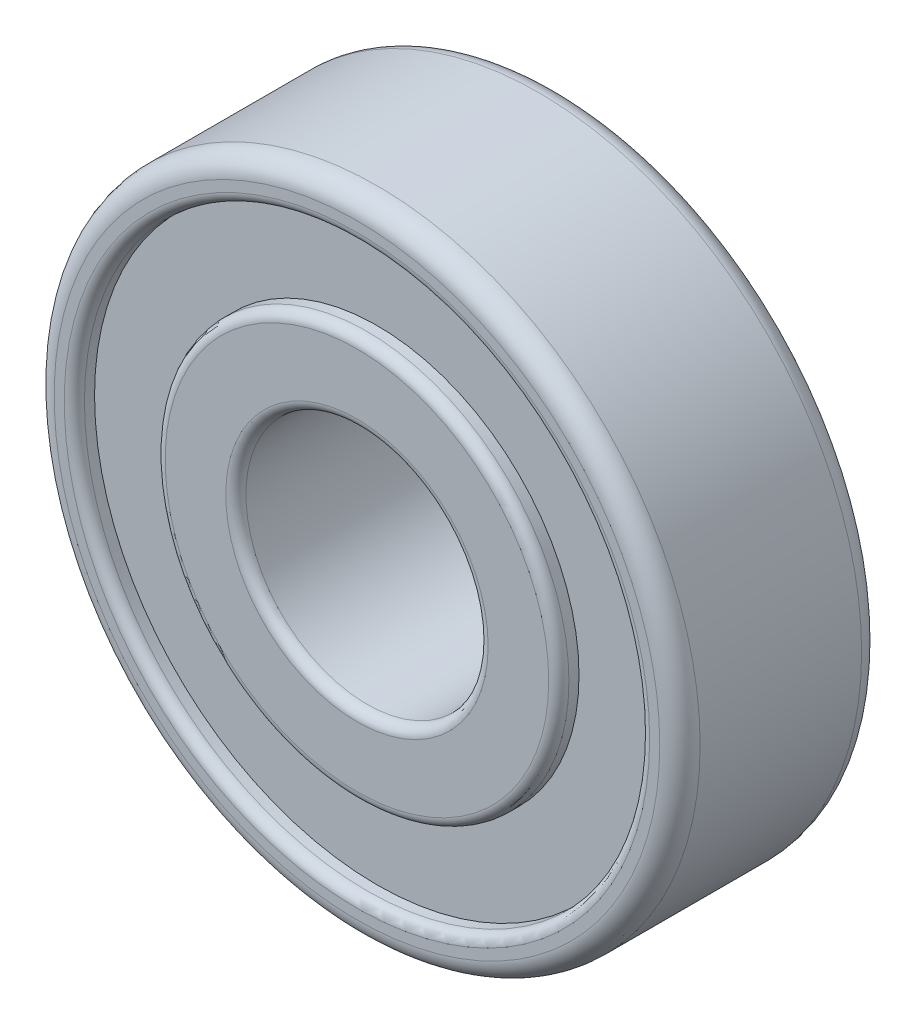
ISO-10303-21;
HEADER;
FILE_DESCRIPTION(('STEP AP214'),'2;1');
FILE_NAME('part.step','',(''),(''),'','','');
FILE_SCHEMA(('AUTOMOTIVE_DESIGN { 1 0 10303 214 1 1 1 1 }'));
ENDSEC;
DATA;
#1=APPLICATION_CONTEXT('core data for automotive mechanical design processes');
#2=APPLICATION_PROTOCOL_DEFINITION('international standard','automotive_design',2000,#1);
#3=PRODUCT_CONTEXT('',#1,'mechanical');
#4=PRODUCT('Part','Part','',(#3));
#5=PRODUCT_RELATED_PRODUCT_CATEGORY('part','',(#4));
#6=PRODUCT_DEFINITION_FORMATION('','',#4);
#7=PRODUCT_DEFINITION_CONTEXT('part definition',#1,'design');
#8=PRODUCT_DEFINITION('design','',#6,#7);
#9=PRODUCT_DEFINITION_SHAPE('','',#8);
#10=(LENGTH_UNIT() NAMED_UNIT(*) SI_UNIT(.MILLI.,.METRE.));
#11=(NAMED_UNIT(*) PLANE_ANGLE_UNIT() SI_UNIT($,.RADIAN.));
#12=(NAMED_UNIT(*) SI_UNIT($,.STERADIAN.) SOLID_ANGLE_UNIT());
#13=UNCERTAINTY_MEASURE_WITH_UNIT(LENGTH_MEASURE(1.E-05),#10,'distance_accuracy_value','');
#14=(GEOMETRIC_REPRESENTATION_CONTEXT(3) GLOBAL_UNCERTAINTY_ASSIGNED_CONTEXT((#13)) GLOBAL_UNIT_ASSIGNED_CONTEXT((#10,
#11,#12)) REPRESENTATION_CONTEXT('',''));
#15=CARTESIAN_POINT('',(0.,0.,0.));
#16=DIRECTION('',(0.,0.,1.));
#17=DIRECTION('',(1.,0.,0.));
#18=AXIS2_PLACEMENT_3D('',#15,#16,#17);
#19=CARTESIAN_POINT('',(0.,0.,0.));
#20=DIRECTION('',(0.,0.,1.));
#21=DIRECTION('',(1.,0.,0.));
#22=AXIS2_PLACEMENT_3D('',#19,#20,#21);
#23=PLANE('',#22);
#24=CARTESIAN_POINT('',(0.,0.,0.));
#25=DIRECTION('',(0.,0.,1.));
#26=DIRECTION('',(1.,0.,0.));
#27=AXIS2_PLACEMENT_3D('',#24,#25,#26);
#28=CIRCLE('',#27,6.5);
#29=CARTESIAN_POINT('',(6.5,0.,0.));
#30=VERTEX_POINT('',#29);
#31=EDGE_CURVE('E85',#30,#30,#28,.T.);
#32=ORIENTED_EDGE('',*,*,#31,.T.);
#33=EDGE_LOOP('',(#32));
#34=FACE_BOUND('',#33,.T.);
#35=CARTESIAN_POINT('',(0.,0.,0.));
#36=DIRECTION('',(0.,0.,1.));
#37=DIRECTION('',(1.,0.,0.));
#38=AXIS2_PLACEMENT_3D('',#35,#36,#37);
#39=CIRCLE('',#38,8.5);
#40=CARTESIAN_POINT('',(8.5,0.,0.));
#41=VERTEX_POINT('',#40);
#42=EDGE_CURVE('E89',#41,#41,#39,.F.);
#43=ORIENTED_EDGE('',*,*,#42,.T.);
#44=EDGE_LOOP('',(#43));
#45=FACE_BOUND('',#44,.T.);
#46=ADVANCED_FACE('F37',(#34,#45),#23,.F.);
#47=CARTESIAN_POINT('',(0.,0.,10.));
#48=DIRECTION('',(0.,0.,1.));
#49=DIRECTION('',(1.,0.,0.));
#50=AXIS2_PLACEMENT_3D('',#47,#48,#49);
#51=PLANE('',#50);
#52=CARTESIAN_POINT('',(0.,0.,10.));
#53=DIRECTION('',(0.,0.,1.));
#54=DIRECTION('',(1.,0.,0.));
#55=AXIS2_PLACEMENT_3D('',#52,#53,#54);
#56=CIRCLE('',#55,6.5);
#57=CARTESIAN_POINT('',(6.5,0.,10.));
#58=VERTEX_POINT('',#57);
#59=EDGE_CURVE('E69',#58,#58,#56,.F.);
#60=ORIENTED_EDGE('',*,*,#59,.T.);
#61=EDGE_LOOP('',(#60));
#62=FACE_BOUND('',#61,.T.);
#63=CARTESIAN_POINT('',(0.,0.,10.));
#64=DIRECTION('',(0.,0.,1.));
#65=DIRECTION('',(1.,0.,0.));
#66=AXIS2_PLACEMENT_3D('',#63,#64,#65);
#67=CIRCLE('',#66,9.5);
#68=CARTESIAN_POINT('',(9.5,0.,10.));
#69=VERTEX_POINT('',#68);
#70=EDGE_CURVE('E73',#69,#69,#67,.T.);
#71=ORIENTED_EDGE('',*,*,#70,.T.);
#72=EDGE_LOOP('',(#71));
#73=FACE_BOUND('',#72,.T.);
#74=ADVANCED_FACE('F145',(#62,#73),#51,.T.);
#75=CARTESIAN_POINT('',(0.,0.,10.));
#76=DIRECTION('',(0.,0.,1.));
#77=DIRECTION('',(1.,0.,0.));
#78=AXIS2_PLACEMENT_3D('',#75,#76,#77);
#79=CIRCLE('',#78,14.5);
#80=CARTESIAN_POINT('',(14.5,0.,10.));
#81=VERTEX_POINT('',#80);
#82=EDGE_CURVE('E50',#81,#81,#79,.F.);
#83=ORIENTED_EDGE('',*,*,#82,.T.);
#84=EDGE_LOOP('',(#83));
#85=FACE_BOUND('',#84,.T.);
#86=CARTESIAN_POINT('',(0.,0.,10.));
#87=DIRECTION('',(0.,0.,1.));
#88=DIRECTION('',(1.,0.,0.));
#89=AXIS2_PLACEMENT_3D('',#86,#87,#88);
#90=CIRCLE('',#89,15.);
#91=CARTESIAN_POINT('',(15.,0.,10.));
#92=VERTEX_POINT('',#91);
#93=EDGE_CURVE('E105',#92,#92,#90,.T.);
#94=ORIENTED_EDGE('',*,*,#93,.T.);
#95=EDGE_LOOP('',(#94));
#96=FACE_BOUND('',#95,.T.);
#97=ADVANCED_FACE('F152',(#85,#96),#51,.T.);
#98=CARTESIAN_POINT('',(0.,0.,0.));
#99=DIRECTION('',(0.,0.,1.));
#100=DIRECTION('',(1.,0.,0.));
#101=AXIS2_PLACEMENT_3D('',#98,#99,#100);
#102=CIRCLE('',#101,13.);
#103=CARTESIAN_POINT('',(13.,0.,0.));
#104=VERTEX_POINT('',#103);
#105=EDGE_CURVE('E61',#104,#104,#102,.T.);
#106=ORIENTED_EDGE('',*,*,#105,.T.);
#107=EDGE_LOOP('',(#106));
#108=FACE_BOUND('',#107,.T.);
#109=CARTESIAN_POINT('',(0.,0.,0.));
#110=DIRECTION('',(0.,0.,1.));
#111=DIRECTION('',(1.,0.,0.));
#112=AXIS2_PLACEMENT_3D('',#109,#110,#111);
#113=CIRCLE('',#112,15.);
#114=CARTESIAN_POINT('',(15.,0.,0.));
#115=VERTEX_POINT('',#114);
#116=EDGE_CURVE('E93',#115,#115,#113,.F.);
#117=ORIENTED_EDGE('',*,*,#116,.T.);
#118=EDGE_LOOP('',(#117));
#119=FACE_BOUND('',#118,.T.);
#120=ADVANCED_FACE('F148',(#108,#119),#23,.F.);
#121=CARTESIAN_POINT('',(0.,0.,10.));
#122=DIRECTION('',(0.,0.,-1.));
#123=DIRECTION('',(-1.,0.,0.));
#124=AXIS2_PLACEMENT_3D('',#121,#122,#123);
#125=CYLINDRICAL_SURFACE('',#124,16.);
#126=CARTESIAN_POINT('',(0.,0.,9.));
#127=DIRECTION('',(0.,0.,1.));
#128=DIRECTION('',(1.,0.,0.));
#129=AXIS2_PLACEMENT_3D('',#126,#127,#128);
#130=CIRCLE('',#129,16.);
#131=CARTESIAN_POINT('',(16.,0.,9.));
#132=VERTEX_POINT('',#131);
#133=EDGE_CURVE('E97',#132,#132,#130,.F.);
#134=ORIENTED_EDGE('',*,*,#133,.T.);
#135=EDGE_LOOP('',(#134));
#136=FACE_BOUND('',#135,.T.);
#137=CARTESIAN_POINT('',(0.,0.,0.999999999999999));
#138=DIRECTION('',(0.,0.,1.));
#139=DIRECTION('',(1.,0.,0.));
#140=AXIS2_PLACEMENT_3D('',#137,#138,#139);
#141=CIRCLE('',#140,16.);
#142=CARTESIAN_POINT('',(16.,0.,0.999999999999999));
#143=VERTEX_POINT('',#142);
#144=EDGE_CURVE('E101',#143,#143,#141,.T.);
#145=ORIENTED_EDGE('',*,*,#144,.T.);
#146=EDGE_LOOP('',(#145));
#147=FACE_BOUND('',#146,.T.);
#148=ADVANCED_FACE('F158',(#136,#147),#125,.T.);
#149=CARTESIAN_POINT('',(0.,0.,10.));
#150=DIRECTION('',(0.,0.,-1.));
#151=DIRECTION('',(-1.,0.,0.));
#152=AXIS2_PLACEMENT_3D('',#149,#150,#151);
#153=CYLINDRICAL_SURFACE('',#152,6.);
#154=CARTESIAN_POINT('',(0.,0.,0.5));
#155=DIRECTION('',(0.,0.,1.));
#156=DIRECTION('',(1.,0.,0.));
#157=AXIS2_PLACEMENT_3D('',#154,#155,#156);
#158=CIRCLE('',#157,6.);
#159=CARTESIAN_POINT('',(6.,0.,0.5));
#160=VERTEX_POINT('',#159);
#161=EDGE_CURVE('E77',#160,#160,#158,.F.);
#162=ORIENTED_EDGE('',*,*,#161,.T.);
#163=EDGE_LOOP('',(#162));
#164=FACE_BOUND('',#163,.T.);
#165=CARTESIAN_POINT('',(0.,0.,9.5));
#166=DIRECTION('',(0.,0.,1.));
#167=DIRECTION('',(1.,0.,0.));
#168=AXIS2_PLACEMENT_3D('',#165,#166,#167);
#169=CIRCLE('',#168,6.);
#170=CARTESIAN_POINT('',(6.,0.,9.5));
#171=VERTEX_POINT('',#170);
#172=EDGE_CURVE('E81',#171,#171,#169,.T.);
#173=ORIENTED_EDGE('',*,*,#172,.T.);
#174=EDGE_LOOP('',(#173));
#175=FACE_BOUND('',#174,.T.);
#176=ADVANCED_FACE('F164',(#164,#175),#153,.F.);
#177=CARTESIAN_POINT('',(0.,0.,9.));
#178=DIRECTION('',(0.,0.,1.));
#179=DIRECTION('',(1.,0.,0.));
#180=AXIS2_PLACEMENT_3D('',#177,#178,#179);
#181=CYLINDRICAL_SURFACE('',#180,14.);
#182=CARTESIAN_POINT('',(0.,0.,9.5));
#183=DIRECTION('',(0.,0.,1.));
#184=DIRECTION('',(1.,0.,0.));
#185=AXIS2_PLACEMENT_3D('',#182,#183,#184);
#186=CIRCLE('',#185,14.);
#187=CARTESIAN_POINT('',(14.,0.,9.5));
#188=VERTEX_POINT('',#187);
#189=EDGE_CURVE('E55',#188,#188,#186,.T.);
#190=ORIENTED_EDGE('',*,*,#189,.T.);
#191=EDGE_LOOP('',(#190));
#192=FACE_BOUND('',#191,.T.);
#193=CARTESIAN_POINT('',(0.,0.,9.));
#194=DIRECTION('',(0.,0.,1.));
#195=DIRECTION('',(1.,0.,0.));
#196=AXIS2_PLACEMENT_3D('',#193,#194,#195);
#197=CIRCLE('',#196,14.);
#198=CARTESIAN_POINT('',(14.,0.,9.));
#199=VERTEX_POINT('',#198);
#200=EDGE_CURVE('E109',#199,#199,#197,.T.);
#201=ORIENTED_EDGE('',*,*,#200,.F.);
#202=EDGE_LOOP('',(#201));
#203=FACE_BOUND('',#202,.T.);
#204=ADVANCED_FACE('F270',(#192,#203),#181,.F.);
#205=CARTESIAN_POINT('',(0.,0.,9.));
#206=DIRECTION('',(0.,0.,1.));
#207=DIRECTION('',(1.,0.,0.));
#208=AXIS2_PLACEMENT_3D('',#205,#206,#207);
#209=PLANE('',#208);
#210=CARTESIAN_POINT('',(0.,0.,9.));
#211=DIRECTION('',(0.,0.,1.));
#212=DIRECTION('',(1.,0.,0.));
#213=AXIS2_PLACEMENT_3D('',#210,#211,#212);
#214=CIRCLE('',#213,10.);
#215=CARTESIAN_POINT('',(10.,0.,9.));
#216=VERTEX_POINT('',#215);
#217=EDGE_CURVE('E113',#216,#216,#214,.T.);
#218=ORIENTED_EDGE('',*,*,#217,.F.);
#219=EDGE_LOOP('',(#218));
#220=FACE_BOUND('',#219,.T.);
#221=ORIENTED_EDGE('',*,*,#200,.T.);
#222=EDGE_LOOP('',(#221));
#223=FACE_BOUND('',#222,.T.);
#224=ADVANCED_FACE('F142',(#220,#223),#209,.T.);
#225=CARTESIAN_POINT('',(0.,0.,9.));
#226=DIRECTION('',(0.,0.,1.));
#227=DIRECTION('',(1.,0.,0.));
#228=AXIS2_PLACEMENT_3D('',#225,#226,#227);
#229=CYLINDRICAL_SURFACE('',#228,10.);
#230=CARTESIAN_POINT('',(0.,0.,9.5));
#231=DIRECTION('',(0.,0.,1.));
#232=DIRECTION('',(1.,0.,0.));
#233=AXIS2_PLACEMENT_3D('',#230,#231,#232);
#234=CIRCLE('',#233,10.);
#235=CARTESIAN_POINT('',(10.,0.,9.5));
#236=VERTEX_POINT('',#235);
#237=EDGE_CURVE('E45',#236,#236,#234,.F.);
#238=ORIENTED_EDGE('',*,*,#237,.T.);
#239=EDGE_LOOP('',(#238));
#240=FACE_BOUND('',#239,.T.);
#241=ORIENTED_EDGE('',*,*,#217,.T.);
#242=EDGE_LOOP('',(#241));
#243=FACE_BOUND('',#242,.T.);
#244=ADVANCED_FACE('F136',(#240,#243),#229,.T.);
#245=CARTESIAN_POINT('',(0.,0.,1.));
#246=DIRECTION('',(0.,0.,-1.));
#247=DIRECTION('',(-1.,0.,0.));
#248=AXIS2_PLACEMENT_3D('',#245,#246,#247);
#249=CYLINDRICAL_SURFACE('',#248,12.5);
#250=CARTESIAN_POINT('',(0.,0.,0.5));
#251=DIRECTION('',(0.,0.,1.));
#252=DIRECTION('',(1.,0.,0.));
#253=AXIS2_PLACEMENT_3D('',#250,#251,#252);
#254=CIRCLE('',#253,12.5);
#255=CARTESIAN_POINT('',(12.5,0.,0.5));
#256=VERTEX_POINT('',#255);
#257=EDGE_CURVE('E65',#256,#256,#254,.F.);
#258=ORIENTED_EDGE('',*,*,#257,.T.);
#259=EDGE_LOOP('',(#258));
#260=FACE_BOUND('',#259,.T.);
#261=CARTESIAN_POINT('',(0.,0.,1.));
#262=DIRECTION('',(0.,0.,-1.));
#263=DIRECTION('',(-1.,0.,0.));
#264=AXIS2_PLACEMENT_3D('',#261,#262,#263);
#265=CIRCLE('',#264,12.5);
#266=CARTESIAN_POINT('',(-12.5,0.,1.));
#267=VERTEX_POINT('',#266);
#268=EDGE_CURVE('E117',#267,#267,#265,.T.);
#269=ORIENTED_EDGE('',*,*,#268,.F.);
#270=EDGE_LOOP('',(#269));
#271=FACE_BOUND('',#270,.T.);
#272=ADVANCED_FACE('F131',(#260,#271),#249,.F.);
#273=CARTESIAN_POINT('',(0.,0.,1.));
#274=DIRECTION('',(0.,0.,-1.));
#275=DIRECTION('',(-1.,0.,0.));
#276=AXIS2_PLACEMENT_3D('',#273,#274,#275);
#277=PLANE('',#276);
#278=CARTESIAN_POINT('',(0.,0.,1.));
#279=DIRECTION('',(0.,0.,-1.));
#280=DIRECTION('',(-1.,0.,0.));
#281=AXIS2_PLACEMENT_3D('',#278,#279,#280);
#282=CIRCLE('',#281,9.);
#283=CARTESIAN_POINT('',(-9.,0.,1.));
#284=VERTEX_POINT('',#283);
#285=EDGE_CURVE('E121',#284,#284,#282,.T.);
#286=ORIENTED_EDGE('',*,*,#285,.F.);
#287=EDGE_LOOP('',(#286));
#288=FACE_BOUND('',#287,.T.);
#289=ORIENTED_EDGE('',*,*,#268,.T.);
#290=EDGE_LOOP('',(#289));
#291=FACE_BOUND('',#290,.T.);
#292=ADVANCED_FACE('F128',(#288,#291),#277,.T.);
#293=CARTESIAN_POINT('',(0.,0.,1.));
#294=DIRECTION('',(0.,0.,-1.));
#295=DIRECTION('',(-1.,0.,0.));
#296=AXIS2_PLACEMENT_3D('',#293,#294,#295);
#297=CYLINDRICAL_SURFACE('',#296,9.);
#298=CARTESIAN_POINT('',(0.,0.,0.5));
#299=DIRECTION('',(0.,0.,1.));
#300=DIRECTION('',(1.,0.,0.));
#301=AXIS2_PLACEMENT_3D('',#298,#299,#300);
#302=CIRCLE('',#301,9.);
#303=CARTESIAN_POINT('',(9.,0.,0.5));
#304=VERTEX_POINT('',#303);
#305=EDGE_CURVE('E10',#304,#304,#302,.T.);
#306=ORIENTED_EDGE('',*,*,#305,.T.);
#307=EDGE_LOOP('',(#306));
#308=FACE_BOUND('',#307,.T.);
#309=ORIENTED_EDGE('',*,*,#285,.T.);
#310=EDGE_LOOP('',(#309));
#311=FACE_BOUND('',#310,.T.);
#312=ADVANCED_FACE('F126',(#308,#311),#297,.T.);
#313=CARTESIAN_POINT('',(0.,0.,9.));
#314=DIRECTION('',(0.,0.,1.));
#315=DIRECTION('',(1.,0.,0.));
#316=AXIS2_PLACEMENT_3D('',#313,#314,#315);
#317=TOROIDAL_SURFACE('',#316,15.,1.);
#318=ORIENTED_EDGE('',*,*,#133,.F.);
#319=EDGE_LOOP('',(#318));
#320=FACE_BOUND('',#319,.T.);
#321=ORIENTED_EDGE('',*,*,#93,.F.);
#322=EDGE_LOOP('',(#321));
#323=FACE_BOUND('',#322,.T.);
#324=ADVANCED_FACE('F175',(#320,#323),#317,.T.);
#325=CARTESIAN_POINT('',(0.,0.,0.999999999999999));
#326=DIRECTION('',(0.,0.,1.));
#327=DIRECTION('',(1.,0.,0.));
#328=AXIS2_PLACEMENT_3D('',#325,#326,#327);
#329=TOROIDAL_SURFACE('',#328,15.,1.);
#330=ORIENTED_EDGE('',*,*,#116,.F.);
#331=EDGE_LOOP('',(#330));
#332=FACE_BOUND('',#331,.T.);
#333=ORIENTED_EDGE('',*,*,#144,.F.);
#334=EDGE_LOOP('',(#333));
#335=FACE_BOUND('',#334,.T.);
#336=ADVANCED_FACE('F171',(#332,#335),#329,.T.);
#337=CARTESIAN_POINT('',(0.,0.,0.5));
#338=DIRECTION('',(0.,0.,1.));
#339=DIRECTION('',(1.,0.,0.));
#340=AXIS2_PLACEMENT_3D('',#337,#338,#339);
#341=TOROIDAL_SURFACE('',#340,6.5,0.5);
#342=ORIENTED_EDGE('',*,*,#161,.F.);
#343=EDGE_LOOP('',(#342));
#344=FACE_BOUND('',#343,.T.);
#345=ORIENTED_EDGE('',*,*,#31,.F.);
#346=EDGE_LOOP('',(#345));
#347=FACE_BOUND('',#346,.T.);
#348=ADVANCED_FACE('F174',(#344,#347),#341,.T.);
#349=CARTESIAN_POINT('',(0.,0.,9.5));
#350=DIRECTION('',(0.,0.,1.));
#351=DIRECTION('',(1.,0.,0.));
#352=AXIS2_PLACEMENT_3D('',#349,#350,#351);
#353=TOROIDAL_SURFACE('',#352,6.5,0.5);
#354=ORIENTED_EDGE('',*,*,#59,.F.);
#355=EDGE_LOOP('',(#354));
#356=FACE_BOUND('',#355,.T.);
#357=ORIENTED_EDGE('',*,*,#172,.F.);
#358=EDGE_LOOP('',(#357));
#359=FACE_BOUND('',#358,.T.);
#360=ADVANCED_FACE('F183',(#356,#359),#353,.T.);
#361=CARTESIAN_POINT('',(0.,0.,0.5));
#362=DIRECTION('',(0.,0.,1.));
#363=DIRECTION('',(1.,0.,0.));
#364=AXIS2_PLACEMENT_3D('',#361,#362,#363);
#365=TOROIDAL_SURFACE('',#364,13.,0.5);
#366=ORIENTED_EDGE('',*,*,#105,.F.);
#367=EDGE_LOOP('',(#366));
#368=FACE_BOUND('',#367,.T.);
#369=ORIENTED_EDGE('',*,*,#257,.F.);
#370=EDGE_LOOP('',(#369));
#371=FACE_BOUND('',#370,.T.);
#372=ADVANCED_FACE('F191',(#368,#371),#365,.T.);
#373=CARTESIAN_POINT('',(0.,0.,9.5));
#374=DIRECTION('',(0.,0.,1.));
#375=DIRECTION('',(1.,0.,0.));
#376=AXIS2_PLACEMENT_3D('',#373,#374,#375);
#377=TOROIDAL_SURFACE('',#376,14.5,0.5);
#378=ORIENTED_EDGE('',*,*,#82,.F.);
#379=EDGE_LOOP('',(#378));
#380=FACE_BOUND('',#379,.T.);
#381=ORIENTED_EDGE('',*,*,#189,.F.);
#382=EDGE_LOOP('',(#381));
#383=FACE_BOUND('',#382,.T.);
#384=ADVANCED_FACE('F195',(#380,#383),#377,.T.);
#385=CARTESIAN_POINT('',(0.,0.,9.5));
#386=DIRECTION('',(0.,0.,1.));
#387=DIRECTION('',(1.,0.,0.));
#388=AXIS2_PLACEMENT_3D('',#385,#386,#387);
#389=TOROIDAL_SURFACE('',#388,9.5,0.5);
#390=ORIENTED_EDGE('',*,*,#237,.F.);
#391=EDGE_LOOP('',(#390));
#392=FACE_BOUND('',#391,.T.);
#393=ORIENTED_EDGE('',*,*,#70,.F.);
#394=EDGE_LOOP('',(#393));
#395=FACE_BOUND('',#394,.T.);
#396=ADVANCED_FACE('F198',(#392,#395),#389,.T.);
#397=CARTESIAN_POINT('',(0.,0.,0.5));
#398=DIRECTION('',(0.,0.,1.));
#399=DIRECTION('',(1.,0.,0.));
#400=AXIS2_PLACEMENT_3D('',#397,#398,#399);
#401=TOROIDAL_SURFACE('',#400,8.5,0.5);
#402=ORIENTED_EDGE('',*,*,#305,.F.);
#403=EDGE_LOOP('',(#402));
#404=FACE_BOUND('',#403,.T.);
#405=ORIENTED_EDGE('',*,*,#42,.F.);
#406=EDGE_LOOP('',(#405));
#407=FACE_BOUND('',#406,.T.);
#408=ADVANCED_FACE('F39',(#404,#407),#401,.T.);
#409=CLOSED_SHELL('',(#46,#74,#97,#120,#148,#176,#204,#224,#244,#272,#292,#312,#324,#336,#348,
#360,#372,#384,#396,#408));
#410=MANIFOLD_SOLID_BREP('B2',#409);
#411=ADVANCED_BREP_SHAPE_REPRESENTATION('',(#18,#410),#14);
#412=SHAPE_DEFINITION_REPRESENTATION(#9,#411);
ENDSEC;
END-ISO-10303-21;
